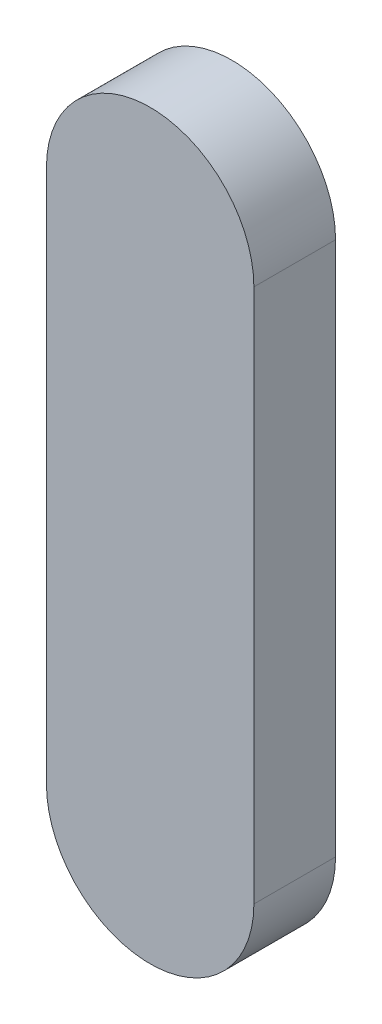
ISO-10303-21;
HEADER;
FILE_DESCRIPTION(('STEP AP214'),'2;1');
FILE_NAME('part.step','',(''),(''),'','','');
FILE_SCHEMA(('AUTOMOTIVE_DESIGN { 1 0 10303 214 1 1 1 1 }'));
ENDSEC;
DATA;
#1=APPLICATION_CONTEXT('core data for automotive mechanical design processes');
#2=APPLICATION_PROTOCOL_DEFINITION('international standard','automotive_design',2000,#1);
#3=PRODUCT_CONTEXT('',#1,'mechanical');
#4=PRODUCT('Part','Part','',(#3));
#5=PRODUCT_RELATED_PRODUCT_CATEGORY('part','',(#4));
#6=PRODUCT_DEFINITION_FORMATION('','',#4);
#7=PRODUCT_DEFINITION_CONTEXT('part definition',#1,'design');
#8=PRODUCT_DEFINITION('design','',#6,#7);
#9=PRODUCT_DEFINITION_SHAPE('','',#8);
#10=(LENGTH_UNIT() NAMED_UNIT(*) SI_UNIT(.MILLI.,.METRE.));
#11=(NAMED_UNIT(*) PLANE_ANGLE_UNIT() SI_UNIT($,.RADIAN.));
#12=(NAMED_UNIT(*) SI_UNIT($,.STERADIAN.) SOLID_ANGLE_UNIT());
#13=UNCERTAINTY_MEASURE_WITH_UNIT(LENGTH_MEASURE(1.E-05),#10,'distance_accuracy_value','');
#14=(GEOMETRIC_REPRESENTATION_CONTEXT(3) GLOBAL_UNCERTAINTY_ASSIGNED_CONTEXT((#13)) GLOBAL_UNIT_ASSIGNED_CONTEXT((#10,
#11,#12)) REPRESENTATION_CONTEXT('',''));
#15=CARTESIAN_POINT('',(0.,0.,0.));
#16=DIRECTION('',(0.,0.,1.));
#17=DIRECTION('',(1.,0.,0.));
#18=AXIS2_PLACEMENT_3D('',#15,#16,#17);
#19=CARTESIAN_POINT('',(92.7664896,66.63614816,0.));
#20=DIRECTION('',(-1.,0.,0.));
#21=DIRECTION('',(0.,1.,0.));
#22=AXIS2_PLACEMENT_3D('',#19,#20,#21);
#23=PLANE('',#22);
#24=DIRECTION('',(0.,1.,0.));
#25=VECTOR('',#24,1.);
#26=CARTESIAN_POINT('',(92.7664896,66.63614816,0.1999996));
#27=LINE('',#26,#25);
#28=CARTESIAN_POINT('',(92.7664896,66.63614816,0.1999996));
#29=VERTEX_POINT('',#28);
#30=CARTESIAN_POINT('',(92.7664896,67.945,0.1999996));
#31=VERTEX_POINT('',#30);
#32=EDGE_CURVE('E11',#29,#31,#27,.T.);
#33=ORIENTED_EDGE('',*,*,#32,.F.);
#34=DIRECTION('',(0.,0.,1.));
#35=VECTOR('',#34,1.);
#36=CARTESIAN_POINT('',(92.7664896,66.63614816,0.));
#37=LINE('',#36,#35);
#38=CARTESIAN_POINT('',(92.7664896,66.63614816,0.));
#39=VERTEX_POINT('',#38);
#40=EDGE_CURVE('E24',#39,#29,#37,.T.);
#41=ORIENTED_EDGE('',*,*,#40,.F.);
#42=DIRECTION('',(0.,1.,0.));
#43=VECTOR('',#42,1.);
#44=CARTESIAN_POINT('',(92.7664896,66.63614816,0.));
#45=LINE('',#44,#43);
#46=CARTESIAN_POINT('',(92.7664896,67.945,0.));
#47=VERTEX_POINT('',#46);
#48=EDGE_CURVE('E75',#39,#47,#45,.T.);
#49=ORIENTED_EDGE('',*,*,#48,.T.);
#50=DIRECTION('',(0.,0.,1.));
#51=VECTOR('',#50,1.);
#52=CARTESIAN_POINT('',(92.7664896,67.945,0.));
#53=LINE('',#52,#51);
#54=EDGE_CURVE('E37',#47,#31,#53,.T.);
#55=ORIENTED_EDGE('',*,*,#54,.T.);
#56=EDGE_LOOP('',(#33,#41,#49,#55));
#57=FACE_BOUND('',#56,.T.);
#58=ADVANCED_FACE('F17',(#57),#23,.F.);
#59=CARTESIAN_POINT('',(92.5124896,67.945,0.));
#60=DIRECTION('',(0.,0.,-1.));
#61=DIRECTION('',(1.,0.,0.));
#62=AXIS2_PLACEMENT_3D('',#59,#60,#61);
#63=CYLINDRICAL_SURFACE('',#62,0.254);
#64=CARTESIAN_POINT('',(92.5124896,67.945,0.1999996));
#65=DIRECTION('',(0.,0.,1.));
#66=DIRECTION('',(1.,0.,0.));
#67=AXIS2_PLACEMENT_3D('',#64,#65,#66);
#68=CIRCLE('',#67,0.254);
#69=CARTESIAN_POINT('',(92.2584896,67.945,0.1999996));
#70=VERTEX_POINT('',#69);
#71=EDGE_CURVE('E83',#31,#70,#68,.T.);
#72=ORIENTED_EDGE('',*,*,#71,.F.);
#73=ORIENTED_EDGE('',*,*,#54,.F.);
#74=CARTESIAN_POINT('',(92.5124896,67.945,0.));
#75=DIRECTION('',(0.,0.,1.));
#76=DIRECTION('',(1.,0.,0.));
#77=AXIS2_PLACEMENT_3D('',#74,#75,#76);
#78=CIRCLE('',#77,0.254);
#79=CARTESIAN_POINT('',(92.2584896,67.945,0.));
#80=VERTEX_POINT('',#79);
#81=EDGE_CURVE('E81',#47,#80,#78,.T.);
#82=ORIENTED_EDGE('',*,*,#81,.T.);
#83=DIRECTION('',(0.,0.,1.));
#84=VECTOR('',#83,1.);
#85=CARTESIAN_POINT('',(92.2584896,67.945,0.));
#86=LINE('',#85,#84);
#87=EDGE_CURVE('E67',#80,#70,#86,.T.);
#88=ORIENTED_EDGE('',*,*,#87,.T.);
#89=EDGE_LOOP('',(#72,#73,#82,#88));
#90=FACE_BOUND('',#89,.T.);
#91=ADVANCED_FACE('F89',(#90),#63,.T.);
#92=CARTESIAN_POINT('',(92.2584896,67.945,0.));
#93=DIRECTION('',(1.,0.,0.));
#94=DIRECTION('',(0.,-1.,0.));
#95=AXIS2_PLACEMENT_3D('',#92,#93,#94);
#96=PLANE('',#95);
#97=DIRECTION('',(0.,-1.,0.));
#98=VECTOR('',#97,1.);
#99=CARTESIAN_POINT('',(92.2584896,67.945,0.1999996));
#100=LINE('',#99,#98);
#101=CARTESIAN_POINT('',(92.2584896,66.63614816,0.1999996));
#102=VERTEX_POINT('',#101);
#103=EDGE_CURVE('E71',#70,#102,#100,.T.);
#104=ORIENTED_EDGE('',*,*,#103,.F.);
#105=ORIENTED_EDGE('',*,*,#87,.F.);
#106=DIRECTION('',(0.,-1.,0.));
#107=VECTOR('',#106,1.);
#108=CARTESIAN_POINT('',(92.2584896,67.945,0.));
#109=LINE('',#108,#107);
#110=CARTESIAN_POINT('',(92.2584896,66.63614816,0.));
#111=VERTEX_POINT('',#110);
#112=EDGE_CURVE('E63',#80,#111,#109,.T.);
#113=ORIENTED_EDGE('',*,*,#112,.T.);
#114=DIRECTION('',(0.,0.,1.));
#115=VECTOR('',#114,1.);
#116=CARTESIAN_POINT('',(92.2584896,66.63614816,0.));
#117=LINE('',#116,#115);
#118=EDGE_CURVE('E53',#111,#102,#117,.T.);
#119=ORIENTED_EDGE('',*,*,#118,.T.);
#120=EDGE_LOOP('',(#104,#105,#113,#119));
#121=FACE_BOUND('',#120,.T.);
#122=ADVANCED_FACE('F66',(#121),#96,.F.);
#123=CARTESIAN_POINT('',(92.5124896,66.63614816,0.));
#124=DIRECTION('',(0.,0.,-1.));
#125=DIRECTION('',(-1.,0.,0.));
#126=AXIS2_PLACEMENT_3D('',#123,#124,#125);
#127=CYLINDRICAL_SURFACE('',#126,0.254000000000005);
#128=CARTESIAN_POINT('',(92.5124896,66.63614816,0.1999996));
#129=DIRECTION('',(0.,0.,1.));
#130=DIRECTION('',(-1.,0.,0.));
#131=AXIS2_PLACEMENT_3D('',#128,#129,#130);
#132=CIRCLE('',#131,0.254000000000005);
#133=EDGE_CURVE('E59',#102,#29,#132,.T.);
#134=ORIENTED_EDGE('',*,*,#133,.F.);
#135=ORIENTED_EDGE('',*,*,#118,.F.);
#136=CARTESIAN_POINT('',(92.5124896,66.63614816,0.));
#137=DIRECTION('',(0.,0.,1.));
#138=DIRECTION('',(-1.,0.,0.));
#139=AXIS2_PLACEMENT_3D('',#136,#137,#138);
#140=CIRCLE('',#139,0.254000000000005);
#141=EDGE_CURVE('E57',#111,#39,#140,.T.);
#142=ORIENTED_EDGE('',*,*,#141,.T.);
#143=ORIENTED_EDGE('',*,*,#40,.T.);
#144=EDGE_LOOP('',(#134,#135,#142,#143));
#145=FACE_BOUND('',#144,.T.);
#146=ADVANCED_FACE('F55',(#145),#127,.T.);
#147=CARTESIAN_POINT('',(92.7664896,66.63614816,0.));
#148=DIRECTION('',(0.,0.,-1.));
#149=DIRECTION('',(-1.,0.,0.));
#150=AXIS2_PLACEMENT_3D('',#147,#148,#149);
#151=PLANE('',#150);
#152=ORIENTED_EDGE('',*,*,#141,.F.);
#153=ORIENTED_EDGE('',*,*,#112,.F.);
#154=ORIENTED_EDGE('',*,*,#81,.F.);
#155=ORIENTED_EDGE('',*,*,#48,.F.);
#156=EDGE_LOOP('',(#152,#153,#154,#155));
#157=FACE_BOUND('',#156,.T.);
#158=ADVANCED_FACE('F74',(#157),#151,.T.);
#159=CARTESIAN_POINT('',(92.7664896,66.63614816,0.1999996));
#160=DIRECTION('',(0.,0.,-1.));
#161=DIRECTION('',(-1.,0.,0.));
#162=AXIS2_PLACEMENT_3D('',#159,#160,#161);
#163=PLANE('',#162);
#164=ORIENTED_EDGE('',*,*,#32,.T.);
#165=ORIENTED_EDGE('',*,*,#71,.T.);
#166=ORIENTED_EDGE('',*,*,#103,.T.);
#167=ORIENTED_EDGE('',*,*,#133,.T.);
#168=EDGE_LOOP('',(#164,#165,#166,#167));
#169=FACE_BOUND('',#168,.T.);
#170=ADVANCED_FACE('F91',(#169),#163,.F.);
#171=CLOSED_SHELL('',(#58,#91,#122,#146,#158,#170));
#172=MANIFOLD_SOLID_BREP('B1',#171);
#173=ADVANCED_BREP_SHAPE_REPRESENTATION('',(#18,#172),#14);
#174=SHAPE_DEFINITION_REPRESENTATION(#9,#173);
ENDSEC;
END-ISO-10303-21;
